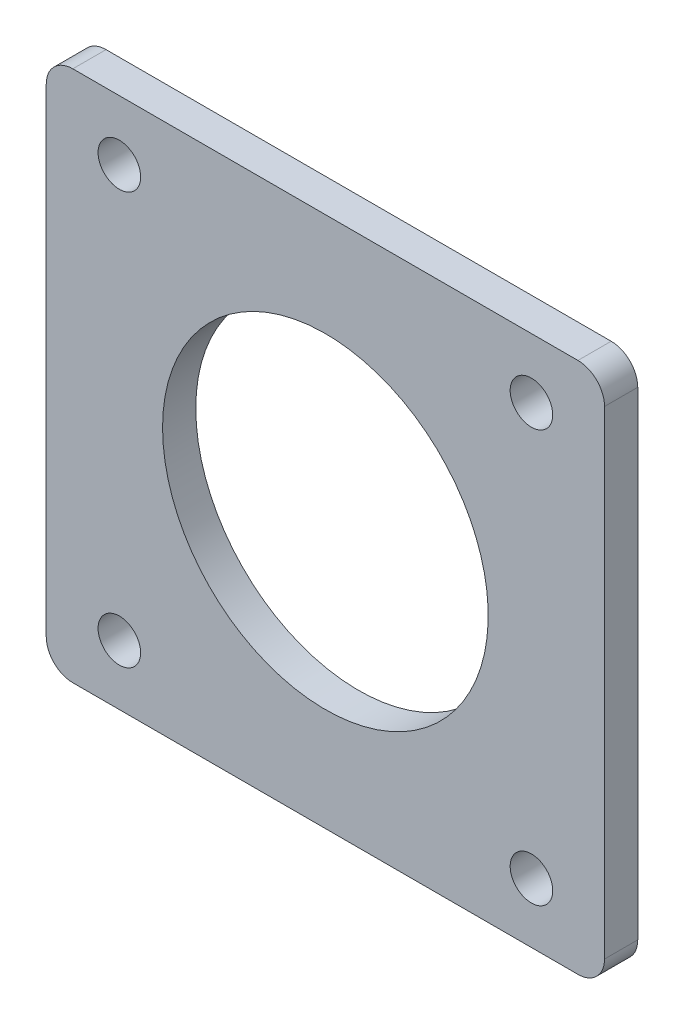
ISO-10303-21;
HEADER;
FILE_DESCRIPTION(('STEP AP214'),'2;1');
FILE_NAME('part.step','',(''),(''),'','','');
FILE_SCHEMA(('AUTOMOTIVE_DESIGN { 1 0 10303 214 1 1 1 1 }'));
ENDSEC;
DATA;
#1=APPLICATION_CONTEXT('core data for automotive mechanical design processes');
#2=APPLICATION_PROTOCOL_DEFINITION('international standard','automotive_design',2000,#1);
#3=PRODUCT_CONTEXT('',#1,'mechanical');
#4=PRODUCT('Part','Part','',(#3));
#5=PRODUCT_RELATED_PRODUCT_CATEGORY('part','',(#4));
#6=PRODUCT_DEFINITION_FORMATION('','',#4);
#7=PRODUCT_DEFINITION_CONTEXT('part definition',#1,'design');
#8=PRODUCT_DEFINITION('design','',#6,#7);
#9=PRODUCT_DEFINITION_SHAPE('','',#8);
#10=(LENGTH_UNIT() NAMED_UNIT(*) SI_UNIT(.MILLI.,.METRE.));
#11=(NAMED_UNIT(*) PLANE_ANGLE_UNIT() SI_UNIT($,.RADIAN.));
#12=(NAMED_UNIT(*) SI_UNIT($,.STERADIAN.) SOLID_ANGLE_UNIT());
#13=UNCERTAINTY_MEASURE_WITH_UNIT(LENGTH_MEASURE(1.E-05),#10,'distance_accuracy_value','');
#14=(GEOMETRIC_REPRESENTATION_CONTEXT(3) GLOBAL_UNCERTAINTY_ASSIGNED_CONTEXT((#13)) GLOBAL_UNIT_ASSIGNED_CONTEXT((#10,
#11,#12)) REPRESENTATION_CONTEXT('',''));
#15=CARTESIAN_POINT('',(0.,0.,0.));
#16=DIRECTION('',(0.,0.,1.));
#17=DIRECTION('',(1.,0.,0.));
#18=AXIS2_PLACEMENT_3D('',#15,#16,#17);
#19=CARTESIAN_POINT('',(-19.,18.,-1.25));
#20=DIRECTION('',(0.,0.,1.));
#21=DIRECTION('',(1.,0.,0.));
#22=AXIS2_PLACEMENT_3D('',#19,#20,#21);
#23=CYLINDRICAL_SURFACE('',#22,2.);
#24=CARTESIAN_POINT('',(-19.,18.,1.25));
#25=DIRECTION('',(0.,0.,1.));
#26=DIRECTION('',(1.,0.,0.));
#27=AXIS2_PLACEMENT_3D('',#24,#25,#26);
#28=CIRCLE('',#27,2.);
#29=CARTESIAN_POINT('',(-19.,20.,1.25));
#30=VERTEX_POINT('',#29);
#31=CARTESIAN_POINT('',(-21.,18.,1.25));
#32=VERTEX_POINT('',#31);
#33=EDGE_CURVE('E142',#30,#32,#28,.T.);
#34=ORIENTED_EDGE('',*,*,#33,.F.);
#35=DIRECTION('',(0.,0.,1.));
#36=VECTOR('',#35,1.);
#37=CARTESIAN_POINT('',(-19.,20.,-1.25));
#38=LINE('',#37,#36);
#39=CARTESIAN_POINT('',(-19.,20.,-1.25));
#40=VERTEX_POINT('',#39);
#41=EDGE_CURVE('E11',#40,#30,#38,.T.);
#42=ORIENTED_EDGE('',*,*,#41,.F.);
#43=CARTESIAN_POINT('',(-19.,18.,-1.25));
#44=DIRECTION('',(0.,0.,1.));
#45=DIRECTION('',(1.,0.,0.));
#46=AXIS2_PLACEMENT_3D('',#43,#44,#45);
#47=CIRCLE('',#46,2.);
#48=CARTESIAN_POINT('',(-21.,18.,-1.25));
#49=VERTEX_POINT('',#48);
#50=EDGE_CURVE('E171',#40,#49,#47,.T.);
#51=ORIENTED_EDGE('',*,*,#50,.T.);
#52=DIRECTION('',(0.,0.,1.));
#53=VECTOR('',#52,1.);
#54=CARTESIAN_POINT('',(-21.,18.,-1.25));
#55=LINE('',#54,#53);
#56=EDGE_CURVE('E42',#49,#32,#55,.T.);
#57=ORIENTED_EDGE('',*,*,#56,.T.);
#58=EDGE_LOOP('',(#34,#42,#51,#57));
#59=FACE_BOUND('',#58,.T.);
#60=ADVANCED_FACE('F39',(#59),#23,.T.);
#61=CARTESIAN_POINT('',(19.,20.,-1.25));
#62=DIRECTION('',(0.,1.,0.));
#63=DIRECTION('',(-1.,0.,0.));
#64=AXIS2_PLACEMENT_3D('',#61,#62,#63);
#65=PLANE('',#64);
#66=DIRECTION('',(-1.,0.,0.));
#67=VECTOR('',#66,1.);
#68=CARTESIAN_POINT('',(19.,20.,1.25));
#69=LINE('',#68,#67);
#70=CARTESIAN_POINT('',(19.,20.,1.25));
#71=VERTEX_POINT('',#70);
#72=EDGE_CURVE('E168',#71,#30,#69,.T.);
#73=ORIENTED_EDGE('',*,*,#72,.F.);
#74=DIRECTION('',(0.,0.,1.));
#75=VECTOR('',#74,1.);
#76=CARTESIAN_POINT('',(19.,20.,-1.25));
#77=LINE('',#76,#75);
#78=CARTESIAN_POINT('',(19.,20.,-1.25));
#79=VERTEX_POINT('',#78);
#80=EDGE_CURVE('E49',#79,#71,#77,.T.);
#81=ORIENTED_EDGE('',*,*,#80,.F.);
#82=DIRECTION('',(-1.,0.,0.));
#83=VECTOR('',#82,1.);
#84=CARTESIAN_POINT('',(19.,20.,-1.25));
#85=LINE('',#84,#83);
#86=EDGE_CURVE('E128',#79,#40,#85,.T.);
#87=ORIENTED_EDGE('',*,*,#86,.T.);
#88=ORIENTED_EDGE('',*,*,#41,.T.);
#89=EDGE_LOOP('',(#73,#81,#87,#88));
#90=FACE_BOUND('',#89,.T.);
#91=ADVANCED_FACE('F189',(#90),#65,.T.);
#92=CARTESIAN_POINT('',(19.,18.,-1.25));
#93=DIRECTION('',(0.,0.,1.));
#94=DIRECTION('',(1.,0.,0.));
#95=AXIS2_PLACEMENT_3D('',#92,#93,#94);
#96=CYLINDRICAL_SURFACE('',#95,2.);
#97=CARTESIAN_POINT('',(19.,18.,1.25));
#98=DIRECTION('',(0.,0.,1.));
#99=DIRECTION('',(1.,0.,0.));
#100=AXIS2_PLACEMENT_3D('',#97,#98,#99);
#101=CIRCLE('',#100,2.);
#102=CARTESIAN_POINT('',(21.,18.,1.25));
#103=VERTEX_POINT('',#102);
#104=EDGE_CURVE('E114',#103,#71,#101,.T.);
#105=ORIENTED_EDGE('',*,*,#104,.F.);
#106=DIRECTION('',(0.,0.,1.));
#107=VECTOR('',#106,1.);
#108=CARTESIAN_POINT('',(21.,18.,-1.25));
#109=LINE('',#108,#107);
#110=CARTESIAN_POINT('',(21.,18.,-1.25));
#111=VERTEX_POINT('',#110);
#112=EDGE_CURVE('E109',#111,#103,#109,.T.);
#113=ORIENTED_EDGE('',*,*,#112,.F.);
#114=CARTESIAN_POINT('',(19.,18.,-1.25));
#115=DIRECTION('',(0.,0.,1.));
#116=DIRECTION('',(1.,0.,0.));
#117=AXIS2_PLACEMENT_3D('',#114,#115,#116);
#118=CIRCLE('',#117,2.);
#119=EDGE_CURVE('E112',#111,#79,#118,.T.);
#120=ORIENTED_EDGE('',*,*,#119,.T.);
#121=ORIENTED_EDGE('',*,*,#80,.T.);
#122=EDGE_LOOP('',(#105,#113,#120,#121));
#123=FACE_BOUND('',#122,.T.);
#124=ADVANCED_FACE('F111',(#123),#96,.T.);
#125=CARTESIAN_POINT('',(21.,-18.,-1.25));
#126=DIRECTION('',(1.,0.,0.));
#127=DIRECTION('',(0.,0.,-1.));
#128=AXIS2_PLACEMENT_3D('',#125,#126,#127);
#129=PLANE('',#128);
#130=DIRECTION('',(0.,1.,0.));
#131=VECTOR('',#130,1.);
#132=CARTESIAN_POINT('',(21.,-18.,1.25));
#133=LINE('',#132,#131);
#134=CARTESIAN_POINT('',(21.,-18.,1.25));
#135=VERTEX_POINT('',#134);
#136=EDGE_CURVE('E163',#135,#103,#133,.T.);
#137=ORIENTED_EDGE('',*,*,#136,.F.);
#138=DIRECTION('',(0.,0.,1.));
#139=VECTOR('',#138,1.);
#140=CARTESIAN_POINT('',(21.,-18.,-1.25));
#141=LINE('',#140,#139);
#142=CARTESIAN_POINT('',(21.,-18.,-1.25));
#143=VERTEX_POINT('',#142);
#144=EDGE_CURVE('E120',#143,#135,#141,.T.);
#145=ORIENTED_EDGE('',*,*,#144,.F.);
#146=DIRECTION('',(0.,1.,0.));
#147=VECTOR('',#146,1.);
#148=CARTESIAN_POINT('',(21.,-18.,-1.25));
#149=LINE('',#148,#147);
#150=EDGE_CURVE('E126',#143,#111,#149,.T.);
#151=ORIENTED_EDGE('',*,*,#150,.T.);
#152=ORIENTED_EDGE('',*,*,#112,.T.);
#153=EDGE_LOOP('',(#137,#145,#151,#152));
#154=FACE_BOUND('',#153,.T.);
#155=ADVANCED_FACE('F131',(#154),#129,.T.);
#156=CARTESIAN_POINT('',(19.,-18.,-1.25));
#157=DIRECTION('',(0.,0.,1.));
#158=DIRECTION('',(1.,0.,0.));
#159=AXIS2_PLACEMENT_3D('',#156,#157,#158);
#160=CYLINDRICAL_SURFACE('',#159,2.);
#161=CARTESIAN_POINT('',(19.,-18.,1.25));
#162=DIRECTION('',(0.,0.,1.));
#163=DIRECTION('',(1.,0.,0.));
#164=AXIS2_PLACEMENT_3D('',#161,#162,#163);
#165=CIRCLE('',#164,2.);
#166=CARTESIAN_POINT('',(19.,-20.,1.25));
#167=VERTEX_POINT('',#166);
#168=EDGE_CURVE('E159',#167,#135,#165,.T.);
#169=ORIENTED_EDGE('',*,*,#168,.F.);
#170=DIRECTION('',(0.,0.,1.));
#171=VECTOR('',#170,1.);
#172=CARTESIAN_POINT('',(19.,-20.,-1.25));
#173=LINE('',#172,#171);
#174=CARTESIAN_POINT('',(19.,-20.,-1.25));
#175=VERTEX_POINT('',#174);
#176=EDGE_CURVE('E177',#175,#167,#173,.T.);
#177=ORIENTED_EDGE('',*,*,#176,.F.);
#178=CARTESIAN_POINT('',(19.,-18.,-1.25));
#179=DIRECTION('',(0.,0.,1.));
#180=DIRECTION('',(1.,0.,0.));
#181=AXIS2_PLACEMENT_3D('',#178,#179,#180);
#182=CIRCLE('',#181,2.);
#183=EDGE_CURVE('E133',#175,#143,#182,.T.);
#184=ORIENTED_EDGE('',*,*,#183,.T.);
#185=ORIENTED_EDGE('',*,*,#144,.T.);
#186=EDGE_LOOP('',(#169,#177,#184,#185));
#187=FACE_BOUND('',#186,.T.);
#188=ADVANCED_FACE('F202',(#187),#160,.T.);
#189=CARTESIAN_POINT('',(-19.,-20.,-1.25));
#190=DIRECTION('',(0.,-1.,0.));
#191=DIRECTION('',(0.,0.,-1.));
#192=AXIS2_PLACEMENT_3D('',#189,#190,#191);
#193=PLANE('',#192);
#194=DIRECTION('',(1.,0.,0.));
#195=VECTOR('',#194,1.);
#196=CARTESIAN_POINT('',(-19.,-20.,1.25));
#197=LINE('',#196,#195);
#198=CARTESIAN_POINT('',(-19.,-20.,1.25));
#199=VERTEX_POINT('',#198);
#200=EDGE_CURVE('E155',#199,#167,#197,.T.);
#201=ORIENTED_EDGE('',*,*,#200,.F.);
#202=DIRECTION('',(0.,0.,1.));
#203=VECTOR('',#202,1.);
#204=CARTESIAN_POINT('',(-19.,-20.,-1.25));
#205=LINE('',#204,#203);
#206=CARTESIAN_POINT('',(-19.,-20.,-1.25));
#207=VERTEX_POINT('',#206);
#208=EDGE_CURVE('E180',#207,#199,#205,.T.);
#209=ORIENTED_EDGE('',*,*,#208,.F.);
#210=DIRECTION('',(1.,0.,0.));
#211=VECTOR('',#210,1.);
#212=CARTESIAN_POINT('',(-19.,-20.,-1.25));
#213=LINE('',#212,#211);
#214=EDGE_CURVE('E136',#207,#175,#213,.T.);
#215=ORIENTED_EDGE('',*,*,#214,.T.);
#216=ORIENTED_EDGE('',*,*,#176,.T.);
#217=EDGE_LOOP('',(#201,#209,#215,#216));
#218=FACE_BOUND('',#217,.T.);
#219=ADVANCED_FACE('F205',(#218),#193,.T.);
#220=CARTESIAN_POINT('',(-19.,-18.,-1.25));
#221=DIRECTION('',(0.,0.,1.));
#222=DIRECTION('',(1.,0.,0.));
#223=AXIS2_PLACEMENT_3D('',#220,#221,#222);
#224=CYLINDRICAL_SURFACE('',#223,2.);
#225=CARTESIAN_POINT('',(-19.,-18.,1.25));
#226=DIRECTION('',(0.,0.,1.));
#227=DIRECTION('',(1.,0.,0.));
#228=AXIS2_PLACEMENT_3D('',#225,#226,#227);
#229=CIRCLE('',#228,2.);
#230=CARTESIAN_POINT('',(-21.,-18.,1.25));
#231=VERTEX_POINT('',#230);
#232=EDGE_CURVE('E151',#231,#199,#229,.T.);
#233=ORIENTED_EDGE('',*,*,#232,.F.);
#234=DIRECTION('',(0.,0.,1.));
#235=VECTOR('',#234,1.);
#236=CARTESIAN_POINT('',(-21.,-18.,-1.25));
#237=LINE('',#236,#235);
#238=CARTESIAN_POINT('',(-21.,-18.,-1.25));
#239=VERTEX_POINT('',#238);
#240=EDGE_CURVE('E182',#239,#231,#237,.T.);
#241=ORIENTED_EDGE('',*,*,#240,.F.);
#242=CARTESIAN_POINT('',(-19.,-18.,-1.25));
#243=DIRECTION('',(0.,0.,1.));
#244=DIRECTION('',(1.,0.,0.));
#245=AXIS2_PLACEMENT_3D('',#242,#243,#244);
#246=CIRCLE('',#245,2.);
#247=EDGE_CURVE('E293',#239,#207,#246,.T.);
#248=ORIENTED_EDGE('',*,*,#247,.T.);
#249=ORIENTED_EDGE('',*,*,#208,.T.);
#250=EDGE_LOOP('',(#233,#241,#248,#249));
#251=FACE_BOUND('',#250,.T.);
#252=ADVANCED_FACE('F209',(#251),#224,.T.);
#253=CARTESIAN_POINT('',(-21.,18.,-1.25));
#254=DIRECTION('',(-1.,0.,0.));
#255=DIRECTION('',(0.,-1.,0.));
#256=AXIS2_PLACEMENT_3D('',#253,#254,#255);
#257=PLANE('',#256);
#258=DIRECTION('',(0.,-1.,0.));
#259=VECTOR('',#258,1.);
#260=CARTESIAN_POINT('',(-21.,18.,1.25));
#261=LINE('',#260,#259);
#262=EDGE_CURVE('E146',#32,#231,#261,.T.);
#263=ORIENTED_EDGE('',*,*,#262,.F.);
#264=ORIENTED_EDGE('',*,*,#56,.F.);
#265=DIRECTION('',(0.,-1.,0.));
#266=VECTOR('',#265,1.);
#267=CARTESIAN_POINT('',(-21.,18.,-1.25));
#268=LINE('',#267,#266);
#269=EDGE_CURVE('E290',#49,#239,#268,.T.);
#270=ORIENTED_EDGE('',*,*,#269,.T.);
#271=ORIENTED_EDGE('',*,*,#240,.T.);
#272=EDGE_LOOP('',(#263,#264,#270,#271));
#273=FACE_BOUND('',#272,.T.);
#274=ADVANCED_FACE('F186',(#273),#257,.T.);
#275=CARTESIAN_POINT('',(-19.,18.,-1.25));
#276=DIRECTION('',(0.,0.,1.));
#277=DIRECTION('',(1.,0.,0.));
#278=AXIS2_PLACEMENT_3D('',#275,#276,#277);
#279=PLANE('',#278);
#280=CARTESIAN_POINT('',(15.5,15.5,-1.25));
#281=DIRECTION('',(0.,0.,1.));
#282=DIRECTION('',(-1.,0.,0.));
#283=AXIS2_PLACEMENT_3D('',#280,#281,#282);
#284=CIRCLE('',#283,1.6);
#285=CARTESIAN_POINT('',(13.9,15.5,-1.25));
#286=VERTEX_POINT('',#285);
#287=EDGE_CURVE('E248',#286,#286,#284,.T.);
#288=ORIENTED_EDGE('',*,*,#287,.T.);
#289=EDGE_LOOP('',(#288));
#290=FACE_BOUND('',#289,.T.);
#291=CARTESIAN_POINT('',(-15.5,-15.5,-1.25));
#292=DIRECTION('',(0.,0.,1.));
#293=DIRECTION('',(-1.,0.,0.));
#294=AXIS2_PLACEMENT_3D('',#291,#292,#293);
#295=CIRCLE('',#294,1.6);
#296=CARTESIAN_POINT('',(-17.1,-15.5,-1.25));
#297=VERTEX_POINT('',#296);
#298=EDGE_CURVE('E258',#297,#297,#295,.T.);
#299=ORIENTED_EDGE('',*,*,#298,.T.);
#300=EDGE_LOOP('',(#299));
#301=FACE_BOUND('',#300,.T.);
#302=CARTESIAN_POINT('',(0.,0.,-1.25));
#303=DIRECTION('',(0.,0.,1.));
#304=DIRECTION('',(-1.,0.,0.));
#305=AXIS2_PLACEMENT_3D('',#302,#303,#304);
#306=CIRCLE('',#305,12.25);
#307=CARTESIAN_POINT('',(-12.25,0.,-1.25));
#308=VERTEX_POINT('',#307);
#309=EDGE_CURVE('E266',#308,#308,#306,.T.);
#310=ORIENTED_EDGE('',*,*,#309,.T.);
#311=EDGE_LOOP('',(#310));
#312=FACE_BOUND('',#311,.T.);
#313=CARTESIAN_POINT('',(15.5,-15.5,-1.25));
#314=DIRECTION('',(0.,0.,1.));
#315=DIRECTION('',(-1.,0.,0.));
#316=AXIS2_PLACEMENT_3D('',#313,#314,#315);
#317=CIRCLE('',#316,1.6);
#318=CARTESIAN_POINT('',(13.9,-15.5,-1.25));
#319=VERTEX_POINT('',#318);
#320=EDGE_CURVE('E274',#319,#319,#317,.T.);
#321=ORIENTED_EDGE('',*,*,#320,.T.);
#322=EDGE_LOOP('',(#321));
#323=FACE_BOUND('',#322,.T.);
#324=CARTESIAN_POINT('',(-15.5,15.5,-1.25));
#325=DIRECTION('',(0.,0.,1.));
#326=DIRECTION('',(-1.,0.,0.));
#327=AXIS2_PLACEMENT_3D('',#324,#325,#326);
#328=CIRCLE('',#327,1.6);
#329=CARTESIAN_POINT('',(-17.1,15.5,-1.25));
#330=VERTEX_POINT('',#329);
#331=EDGE_CURVE('E147',#330,#330,#328,.T.);
#332=ORIENTED_EDGE('',*,*,#331,.T.);
#333=EDGE_LOOP('',(#332));
#334=FACE_BOUND('',#333,.T.);
#335=ORIENTED_EDGE('',*,*,#50,.F.);
#336=ORIENTED_EDGE('',*,*,#86,.F.);
#337=ORIENTED_EDGE('',*,*,#119,.F.);
#338=ORIENTED_EDGE('',*,*,#150,.F.);
#339=ORIENTED_EDGE('',*,*,#183,.F.);
#340=ORIENTED_EDGE('',*,*,#214,.F.);
#341=ORIENTED_EDGE('',*,*,#247,.F.);
#342=ORIENTED_EDGE('',*,*,#269,.F.);
#343=EDGE_LOOP('',(#335,#336,#337,#338,#339,#340,#341,#342));
#344=FACE_BOUND('',#343,.T.);
#345=ADVANCED_FACE('F124',(#290,#301,#312,#323,#334,#344),#279,.F.);
#346=CARTESIAN_POINT('',(-19.,18.,1.25));
#347=DIRECTION('',(0.,0.,1.));
#348=DIRECTION('',(1.,0.,0.));
#349=AXIS2_PLACEMENT_3D('',#346,#347,#348);
#350=PLANE('',#349);
#351=CARTESIAN_POINT('',(15.5,15.5,1.25));
#352=DIRECTION('',(0.,0.,1.));
#353=DIRECTION('',(-1.,0.,0.));
#354=AXIS2_PLACEMENT_3D('',#351,#352,#353);
#355=CIRCLE('',#354,1.6);
#356=CARTESIAN_POINT('',(13.9,15.5,1.25));
#357=VERTEX_POINT('',#356);
#358=EDGE_CURVE('E251',#357,#357,#355,.T.);
#359=ORIENTED_EDGE('',*,*,#358,.F.);
#360=EDGE_LOOP('',(#359));
#361=FACE_BOUND('',#360,.T.);
#362=CARTESIAN_POINT('',(-15.5,-15.5,1.25));
#363=DIRECTION('',(0.,0.,1.));
#364=DIRECTION('',(-1.,0.,0.));
#365=AXIS2_PLACEMENT_3D('',#362,#363,#364);
#366=CIRCLE('',#365,1.6);
#367=CARTESIAN_POINT('',(-17.1,-15.5,1.25));
#368=VERTEX_POINT('',#367);
#369=EDGE_CURVE('E255',#368,#368,#366,.T.);
#370=ORIENTED_EDGE('',*,*,#369,.F.);
#371=EDGE_LOOP('',(#370));
#372=FACE_BOUND('',#371,.T.);
#373=CARTESIAN_POINT('',(0.,0.,1.25));
#374=DIRECTION('',(0.,0.,1.));
#375=DIRECTION('',(-1.,0.,0.));
#376=AXIS2_PLACEMENT_3D('',#373,#374,#375);
#377=CIRCLE('',#376,12.25);
#378=CARTESIAN_POINT('',(-12.25,0.,1.25));
#379=VERTEX_POINT('',#378);
#380=EDGE_CURVE('E262',#379,#379,#377,.T.);
#381=ORIENTED_EDGE('',*,*,#380,.F.);
#382=EDGE_LOOP('',(#381));
#383=FACE_BOUND('',#382,.T.);
#384=CARTESIAN_POINT('',(15.5,-15.5,1.25));
#385=DIRECTION('',(0.,0.,1.));
#386=DIRECTION('',(-1.,0.,0.));
#387=AXIS2_PLACEMENT_3D('',#384,#385,#386);
#388=CIRCLE('',#387,1.6);
#389=CARTESIAN_POINT('',(13.9,-15.5,1.25));
#390=VERTEX_POINT('',#389);
#391=EDGE_CURVE('E270',#390,#390,#388,.T.);
#392=ORIENTED_EDGE('',*,*,#391,.F.);
#393=EDGE_LOOP('',(#392));
#394=FACE_BOUND('',#393,.T.);
#395=CARTESIAN_POINT('',(-15.5,15.5,1.25));
#396=DIRECTION('',(0.,0.,1.));
#397=DIRECTION('',(-1.,0.,0.));
#398=AXIS2_PLACEMENT_3D('',#395,#396,#397);
#399=CIRCLE('',#398,1.6);
#400=CARTESIAN_POINT('',(-17.1,15.5,1.25));
#401=VERTEX_POINT('',#400);
#402=EDGE_CURVE('E278',#401,#401,#399,.T.);
#403=ORIENTED_EDGE('',*,*,#402,.F.);
#404=EDGE_LOOP('',(#403));
#405=FACE_BOUND('',#404,.T.);
#406=ORIENTED_EDGE('',*,*,#33,.T.);
#407=ORIENTED_EDGE('',*,*,#262,.T.);
#408=ORIENTED_EDGE('',*,*,#232,.T.);
#409=ORIENTED_EDGE('',*,*,#200,.T.);
#410=ORIENTED_EDGE('',*,*,#168,.T.);
#411=ORIENTED_EDGE('',*,*,#136,.T.);
#412=ORIENTED_EDGE('',*,*,#104,.T.);
#413=ORIENTED_EDGE('',*,*,#72,.T.);
#414=EDGE_LOOP('',(#406,#407,#408,#409,#410,#411,#412,#413));
#415=FACE_BOUND('',#414,.T.);
#416=ADVANCED_FACE('F188',(#361,#372,#383,#394,#405,#415),#350,.T.);
#417=CARTESIAN_POINT('',(-15.5,15.5,-1.25));
#418=DIRECTION('',(0.,0.,1.));
#419=DIRECTION('',(1.,0.,0.));
#420=AXIS2_PLACEMENT_3D('',#417,#418,#419);
#421=CYLINDRICAL_SURFACE('',#420,1.6);
#422=ORIENTED_EDGE('',*,*,#331,.F.);
#423=EDGE_LOOP('',(#422));
#424=FACE_BOUND('',#423,.T.);
#425=ORIENTED_EDGE('',*,*,#402,.T.);
#426=EDGE_LOOP('',(#425));
#427=FACE_BOUND('',#426,.T.);
#428=ADVANCED_FACE('F221',(#424,#427),#421,.F.);
#429=CARTESIAN_POINT('',(15.5,-15.5,-1.25));
#430=DIRECTION('',(0.,0.,1.));
#431=DIRECTION('',(1.,0.,0.));
#432=AXIS2_PLACEMENT_3D('',#429,#430,#431);
#433=CYLINDRICAL_SURFACE('',#432,1.6);
#434=ORIENTED_EDGE('',*,*,#320,.F.);
#435=EDGE_LOOP('',(#434));
#436=FACE_BOUND('',#435,.T.);
#437=ORIENTED_EDGE('',*,*,#391,.T.);
#438=EDGE_LOOP('',(#437));
#439=FACE_BOUND('',#438,.T.);
#440=ADVANCED_FACE('F228',(#436,#439),#433,.F.);
#441=CARTESIAN_POINT('',(0.,0.,-1.25));
#442=DIRECTION('',(0.,0.,1.));
#443=DIRECTION('',(1.,0.,0.));
#444=AXIS2_PLACEMENT_3D('',#441,#442,#443);
#445=CYLINDRICAL_SURFACE('',#444,12.25);
#446=ORIENTED_EDGE('',*,*,#309,.F.);
#447=EDGE_LOOP('',(#446));
#448=FACE_BOUND('',#447,.T.);
#449=ORIENTED_EDGE('',*,*,#380,.T.);
#450=EDGE_LOOP('',(#449));
#451=FACE_BOUND('',#450,.T.);
#452=ADVANCED_FACE('F232',(#448,#451),#445,.F.);
#453=CARTESIAN_POINT('',(-15.5,-15.5,-1.25));
#454=DIRECTION('',(0.,0.,1.));
#455=DIRECTION('',(1.,0.,0.));
#456=AXIS2_PLACEMENT_3D('',#453,#454,#455);
#457=CYLINDRICAL_SURFACE('',#456,1.6);
#458=ORIENTED_EDGE('',*,*,#298,.F.);
#459=EDGE_LOOP('',(#458));
#460=FACE_BOUND('',#459,.T.);
#461=ORIENTED_EDGE('',*,*,#369,.T.);
#462=EDGE_LOOP('',(#461));
#463=FACE_BOUND('',#462,.T.);
#464=ADVANCED_FACE('F236',(#460,#463),#457,.F.);
#465=CARTESIAN_POINT('',(15.5,15.5,-1.25));
#466=DIRECTION('',(0.,0.,1.));
#467=DIRECTION('',(1.,0.,0.));
#468=AXIS2_PLACEMENT_3D('',#465,#466,#467);
#469=CYLINDRICAL_SURFACE('',#468,1.6);
#470=ORIENTED_EDGE('',*,*,#287,.F.);
#471=EDGE_LOOP('',(#470));
#472=FACE_BOUND('',#471,.T.);
#473=ORIENTED_EDGE('',*,*,#358,.T.);
#474=EDGE_LOOP('',(#473));
#475=FACE_BOUND('',#474,.T.);
#476=ADVANCED_FACE('F240',(#472,#475),#469,.F.);
#477=CLOSED_SHELL('',(#60,#91,#124,#155,#188,#219,#252,#274,#345,#416,#428,#440,#452,#464,#476));
#478=MANIFOLD_SOLID_BREP('B2',#477);
#479=ADVANCED_BREP_SHAPE_REPRESENTATION('',(#18,#478),#14);
#480=SHAPE_DEFINITION_REPRESENTATION(#9,#479);
ENDSEC;
END-ISO-10303-21;
